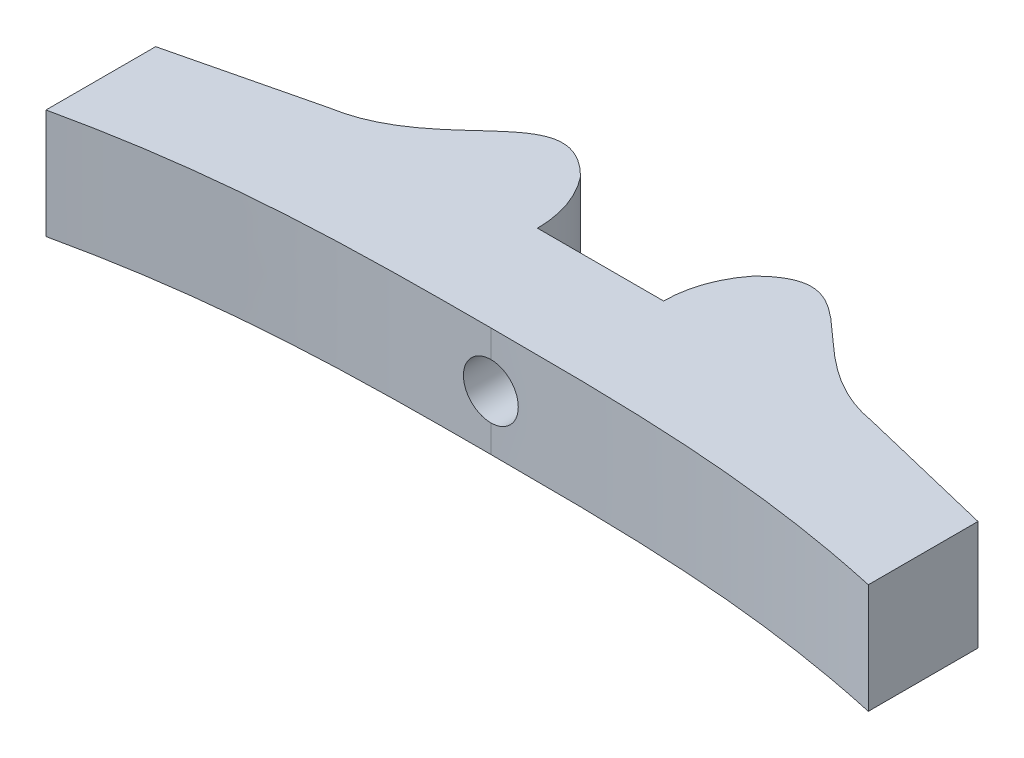
ISO-10303-21;
HEADER;
FILE_DESCRIPTION(('STEP AP214'),'2;1');
FILE_NAME('part.step','',(''),(''),'','','');
FILE_SCHEMA(('AUTOMOTIVE_DESIGN { 1 0 10303 214 1 1 1 1 }'));
ENDSEC;
DATA;
#1=APPLICATION_CONTEXT('core data for automotive mechanical design processes');
#2=APPLICATION_PROTOCOL_DEFINITION('international standard','automotive_design',2000,#1);
#3=PRODUCT_CONTEXT('',#1,'mechanical');
#4=PRODUCT('Part','Part','',(#3));
#5=PRODUCT_RELATED_PRODUCT_CATEGORY('part','',(#4));
#6=PRODUCT_DEFINITION_FORMATION('','',#4);
#7=PRODUCT_DEFINITION_CONTEXT('part definition',#1,'design');
#8=PRODUCT_DEFINITION('design','',#6,#7);
#9=PRODUCT_DEFINITION_SHAPE('','',#8);
#10=(LENGTH_UNIT() NAMED_UNIT(*) SI_UNIT(.MILLI.,.METRE.));
#11=(NAMED_UNIT(*) PLANE_ANGLE_UNIT() SI_UNIT($,.RADIAN.));
#12=(NAMED_UNIT(*) SI_UNIT($,.STERADIAN.) SOLID_ANGLE_UNIT());
#13=UNCERTAINTY_MEASURE_WITH_UNIT(LENGTH_MEASURE(1.E-05),#10,'distance_accuracy_value','');
#14=(GEOMETRIC_REPRESENTATION_CONTEXT(3) GLOBAL_UNCERTAINTY_ASSIGNED_CONTEXT((#13)) GLOBAL_UNIT_ASSIGNED_CONTEXT((#10,
#11,#12)) REPRESENTATION_CONTEXT('',''));
#15=CARTESIAN_POINT('',(0.,0.,0.));
#16=DIRECTION('',(0.,0.,1.));
#17=DIRECTION('',(1.,0.,0.));
#18=AXIS2_PLACEMENT_3D('',#15,#16,#17);
#19=CARTESIAN_POINT('',(-19.05,5.08,6.64176426052734));
#20=CARTESIAN_POINT('',(-12.2108875447227,5.08,5.13329478113357));
#21=CARTESIAN_POINT('',(-6.48799064651243,5.08,5.08));
#22=CARTESIAN_POINT('',(0.,5.08,5.08));
#23=B_SPLINE_CURVE_WITH_KNOTS('',3,(#19,#20,#21,#22),.UNSPECIFIED.,.F.,.F.,(4,4),(0.,1.),.UNSPECIFIED.);
#24=DIRECTION('',(0.,-1.,0.));
#25=VECTOR('',#24,1.);
#26=SURFACE_OF_LINEAR_EXTRUSION('',#23,#25);
#27=DIRECTION('',(0.,-1.,0.));
#28=VECTOR('',#27,1.);
#29=CARTESIAN_POINT('',(0.,5.08,5.08));
#30=LINE('',#29,#28);
#31=CARTESIAN_POINT('',(0.,1.27,5.08));
#32=VERTEX_POINT('',#31);
#33=CARTESIAN_POINT('',(0.,0.,5.08));
#34=VERTEX_POINT('',#33);
#35=EDGE_CURVE('E42',#32,#34,#30,.T.);
#36=ORIENTED_EDGE('',*,*,#35,.F.);
#37=CARTESIAN_POINT('',(0.,1.27,5.08));
#38=CARTESIAN_POINT('',(-0.0357302752545221,1.26999964347344,5.07999998931521));
#39=CARTESIAN_POINT('',(-0.0714447181891026,1.27150857866227,5.0800016190983));
#40=CARTESIAN_POINT('',(-0.142616127848637,1.27752758238914,5.0800085296371));
#41=CARTESIAN_POINT('',(-0.178073120382655,1.28203734577878,5.08001381002158));
#42=CARTESIAN_POINT('',(-0.283619615093024,1.30002332664184,5.0800356595675));
#43=CARTESIAN_POINT('',(-0.352998205928226,1.31795635699132,5.08005823478345));
#44=CARTESIAN_POINT('',(-0.487786709185454,1.36523728293279,5.08012014991618));
#45=CARTESIAN_POINT('',(-0.553194764009821,1.39459047453563,5.08015949761188));
#46=CARTESIAN_POINT('',(-0.646845533960496,1.44648803549575,5.08022920361549));
#47=CARTESIAN_POINT('',(-0.677321945513148,1.46510094520565,5.08025422296175));
#48=CARTESIAN_POINT('',(-0.736630203470928,1.50484234428994,5.08030724662216));
#49=CARTESIAN_POINT('',(-0.765460450785508,1.52597322013882,5.0803352537654));
#50=CARTESIAN_POINT('',(-0.849086338245586,1.59287867866189,5.0804226399528));
#51=CARTESIAN_POINT('',(-0.901097330928893,1.6422106433568,5.08048544607818));
#52=CARTESIAN_POINT('',(-0.996086346639456,1.74891573982974,5.08061257116622));
#53=CARTESIAN_POINT('',(-1.03906435229524,1.80628888707151,5.08067689013179));
#54=CARTESIAN_POINT('',(-1.09583957753939,1.89710355381789,5.08076795823964));
#55=CARTESIAN_POINT('',(-1.11349233890045,1.92819101328751,5.08079743127059));
#56=CARTESIAN_POINT('',(-1.1461029077439,1.99171014528473,5.08085351119176));
#57=CARTESIAN_POINT('',(-1.16106328214546,2.0241405008108,5.08088012080212));
#58=CARTESIAN_POINT('',(-1.20176414362685,2.12316996833055,5.08095418618069));
#59=CARTESIAN_POINT('',(-1.22334249342489,2.19153653617515,5.08099590914958));
#60=CARTESIAN_POINT('',(-1.25470307116908,2.3308881953047,5.08105764945907));
#61=CARTESIAN_POINT('',(-1.26448506906271,2.40187333762927,5.08107766637635));
#62=CARTESIAN_POINT('',(-1.27199693456687,2.54448892390212,5.08109297524417));
#63=CARTESIAN_POINT('',(-1.26972652509974,2.61611938264805,5.08108826662628));
#64=CARTESIAN_POINT('',(-1.25318943614433,2.75798102962741,5.0810548327822));
#65=CARTESIAN_POINT('',(-1.23892289551118,2.82821223404757,5.08102610783401));
#66=CARTESIAN_POINT('',(-1.19880861519168,2.96527573481352,5.08094902311697));
#67=CARTESIAN_POINT('',(-1.17296091213977,3.03210804191024,5.08090066341025));
#68=CARTESIAN_POINT('',(-1.11038592049241,3.16051374537465,5.08079143465688));
#69=CARTESIAN_POINT('',(-1.07365833705579,3.22208699916547,5.08073056527125));
#70=CARTESIAN_POINT('',(-1.01126847965837,3.30910003808684,5.08063641663764));
#71=CARTESIAN_POINT('',(-0.98925085652991,3.33721779378591,5.08060455371491));
#72=CARTESIAN_POINT('',(-0.942906686577498,3.39152937579231,5.08054089106863));
#73=CARTESIAN_POINT('',(-0.918577932038028,3.41772131922997,5.08050909143576));
#74=CARTESIAN_POINT('',(-0.842436490930791,3.49304122649367,5.08041543709395));
#75=CARTESIAN_POINT('',(-0.787412670661504,3.53899114397422,5.08035523824594));
#76=CARTESIAN_POINT('',(-0.670426920638462,3.62098571311283,5.08024628711297));
#77=CARTESIAN_POINT('',(-0.608465254843071,3.65703074143375,5.08019753439276));
#78=CARTESIAN_POINT('',(-0.511665744418292,3.70291858421552,5.08013608281088));
#79=CARTESIAN_POINT('',(-0.478720159588864,3.71686146906602,5.08011753201624));
#80=CARTESIAN_POINT('',(-0.41180473947098,3.74191245938181,5.08008453614289));
#81=CARTESIAN_POINT('',(-0.377835758873321,3.75302286082656,5.08007008773774));
#82=CARTESIAN_POINT('',(-0.274762339887037,3.78196547990777,5.08003306472308));
#83=CARTESIAN_POINT('',(-0.204359749568244,3.79547140808229,5.08001672882296));
#84=CARTESIAN_POINT('',(-0.111264070937656,3.80531502263597,5.08000524390741));
#85=CARTESIAN_POINT('',(-0.0890285966944468,3.80707273582486,5.08000324970009));
#86=CARTESIAN_POINT('',(-0.0445327083838663,3.80941329539492,5.08000063092685));
#87=CARTESIAN_POINT('',(-0.0222723963152364,3.80999807922764,5.08000000410212));
#88=CARTESIAN_POINT('',(0.,3.81,5.08));
#89=B_SPLINE_CURVE_WITH_KNOTS('',3,(#37,#38,#39,#40,#41,#42,#43,#44,#45,#46,#47,#48,#49,#50,#51,
#52,#53,#54,#55,#56,#57,#58,#59,#60,#61,#62,#63,#64,#65,#66,#67,#68,#69,#70,#71,#72,#73,#74,#75,
#76,#77,#78,#79,#80,#81,#82,#83,#84,#85,#86,#87,#88),.UNSPECIFIED.,.F.,.F.,(4,2,2,2,2,2,2,2,2,2,
2,2,2,2,2,2,2,2,2,2,2,2,2,2,2,4),(0.,0.107127555652252,0.214244219375734,0.428141208491133,
0.6421375091309,0.749158701558476,0.856282145456588,1.0702573218197,1.2842329096778,
1.39137069148187,1.49840578076109,1.7123745317022,1.92634745539562,2.14032529822041,
2.35430066428762,2.56827535349595,2.7822558418782,2.88928437121285,2.99641618815525,
3.21039583576486,3.42436734503558,3.53157613385682,3.63869774212231,3.85250915208833,
3.9194050798481,3.98619041722325),.UNSPECIFIED.);
#90=CARTESIAN_POINT('',(0.,3.81,5.08));
#91=VERTEX_POINT('',#90);
#92=EDGE_CURVE('E48',#32,#91,#89,.T.);
#93=ORIENTED_EDGE('',*,*,#92,.T.);
#94=CARTESIAN_POINT('',(0.,5.08,5.08));
#95=VERTEX_POINT('',#94);
#96=EDGE_CURVE('E11',#95,#91,#30,.T.);
#97=ORIENTED_EDGE('',*,*,#96,.F.);
#98=CARTESIAN_POINT('',(-19.05,5.08,6.64176426052734));
#99=VERTEX_POINT('',#98);
#100=EDGE_CURVE('E202',#99,#95,#23,.T.);
#101=ORIENTED_EDGE('',*,*,#100,.F.);
#102=DIRECTION('',(0.,-1.,0.));
#103=VECTOR('',#102,1.);
#104=CARTESIAN_POINT('',(-19.05,5.08,6.64176426052734));
#105=LINE('',#104,#103);
#106=CARTESIAN_POINT('',(-19.05,0.,6.64176426052734));
#107=VERTEX_POINT('',#106);
#108=EDGE_CURVE('E154',#99,#107,#105,.T.);
#109=ORIENTED_EDGE('',*,*,#108,.T.);
#110=CARTESIAN_POINT('',(-19.05,0.,6.64176426052734));
#111=CARTESIAN_POINT('',(-12.2108875447227,0.,5.13329478113357));
#112=CARTESIAN_POINT('',(-6.48799064651243,0.,5.08));
#113=CARTESIAN_POINT('',(0.,0.,5.08));
#114=B_SPLINE_CURVE_WITH_KNOTS('',3,(#110,#111,#112,#113),.UNSPECIFIED.,.F.,.F.,(4,4),(0.,1.),.UNSPECIFIED.);
#115=EDGE_CURVE('E161',#107,#34,#114,.T.);
#116=ORIENTED_EDGE('',*,*,#115,.T.);
#117=EDGE_LOOP('',(#36,#93,#97,#101,#109,#116));
#118=FACE_BOUND('',#117,.T.);
#119=ADVANCED_FACE('F33',(#118),#26,.F.);
#120=CARTESIAN_POINT('',(0.,5.08,5.08));
#121=CARTESIAN_POINT('',(6.48799064651243,5.08,5.08));
#122=CARTESIAN_POINT('',(12.2108875447227,5.08,5.13329478113357));
#123=CARTESIAN_POINT('',(19.05,5.08,6.64176426052734));
#124=B_SPLINE_CURVE_WITH_KNOTS('',3,(#120,#121,#122,#123),.UNSPECIFIED.,.F.,.F.,(4,4),(0.,1.),.UNSPECIFIED.);
#125=DIRECTION('',(0.,-1.,0.));
#126=VECTOR('',#125,1.);
#127=SURFACE_OF_LINEAR_EXTRUSION('',#124,#126);
#128=ORIENTED_EDGE('',*,*,#96,.T.);
#129=CARTESIAN_POINT('',(0.,3.81,5.08));
#130=CARTESIAN_POINT('',(0.035730275254522,3.81000035652656,5.07999998931521));
#131=CARTESIAN_POINT('',(0.0714447181891024,3.80849142133773,5.0800016190983));
#132=CARTESIAN_POINT('',(0.142616127848637,3.80247241761086,5.0800085296371));
#133=CARTESIAN_POINT('',(0.178073120382655,3.79796265422122,5.08001381002158));
#134=CARTESIAN_POINT('',(0.283619615093023,3.77997667335816,5.0800356595675));
#135=CARTESIAN_POINT('',(0.352998205928225,3.76204364300868,5.08005823478345));
#136=CARTESIAN_POINT('',(0.487786709185453,3.71476271706721,5.08012014991618));
#137=CARTESIAN_POINT('',(0.553194764009821,3.68540952546437,5.08015949761188));
#138=CARTESIAN_POINT('',(0.646845533960495,3.63351196450425,5.08022920361549));
#139=CARTESIAN_POINT('',(0.677321945513146,3.61489905479435,5.08025422296175));
#140=CARTESIAN_POINT('',(0.736630203470927,3.57515765571006,5.08030724662216));
#141=CARTESIAN_POINT('',(0.765460450785509,3.55402677986119,5.0803352537654));
#142=CARTESIAN_POINT('',(0.849086338245588,3.48712132133811,5.0804226399528));
#143=CARTESIAN_POINT('',(0.901097330928893,3.4377893566432,5.08048544607818));
#144=CARTESIAN_POINT('',(0.996086346639455,3.33108426017026,5.08061257116622));
#145=CARTESIAN_POINT('',(1.03906435229524,3.27371111292848,5.08067689013179));
#146=CARTESIAN_POINT('',(1.09583957753939,3.18289644618211,5.08076795823964));
#147=CARTESIAN_POINT('',(1.11349233890045,3.15180898671249,5.08079743127059));
#148=CARTESIAN_POINT('',(1.1461029077439,3.08828985471526,5.08085351119176));
#149=CARTESIAN_POINT('',(1.16106328214547,3.0558594991892,5.08088012080212));
#150=CARTESIAN_POINT('',(1.20176414362685,2.95683003166945,5.08095418618069));
#151=CARTESIAN_POINT('',(1.22334249342489,2.88846346382484,5.08099590914958));
#152=CARTESIAN_POINT('',(1.25470307116908,2.7491118046953,5.08105764945907));
#153=CARTESIAN_POINT('',(1.26448506906271,2.67812666237073,5.08107766637635));
#154=CARTESIAN_POINT('',(1.27199693456687,2.53551107609788,5.08109297524417));
#155=CARTESIAN_POINT('',(1.26972652509974,2.46388061735195,5.08108826662628));
#156=CARTESIAN_POINT('',(1.25318943614433,2.32201897037259,5.0810548327822));
#157=CARTESIAN_POINT('',(1.23892289551118,2.25178776595243,5.08102610783401));
#158=CARTESIAN_POINT('',(1.19880861519168,2.11472426518648,5.08094902311697));
#159=CARTESIAN_POINT('',(1.17296091213977,2.04789195808976,5.08090066341025));
#160=CARTESIAN_POINT('',(1.1103859204924,1.91948625462535,5.08079143465688));
#161=CARTESIAN_POINT('',(1.07365833705579,1.85791300083453,5.08073056527125));
#162=CARTESIAN_POINT('',(1.01126847965837,1.77089996191316,5.08063641663764));
#163=CARTESIAN_POINT('',(0.989250856529909,1.74278220621409,5.08060455371491));
#164=CARTESIAN_POINT('',(0.942906686577497,1.68847062420769,5.08054089106864));
#165=CARTESIAN_POINT('',(0.918577932038027,1.66227868077003,5.08050909143576));
#166=CARTESIAN_POINT('',(0.84243649093079,1.58695877350633,5.08041543709395));
#167=CARTESIAN_POINT('',(0.787412670661504,1.54100885602578,5.08035523824594));
#168=CARTESIAN_POINT('',(0.670426920638461,1.45901428688717,5.08024628711297));
#169=CARTESIAN_POINT('',(0.608465254843069,1.42296925856625,5.08019753439276));
#170=CARTESIAN_POINT('',(0.511665744418291,1.37708141578448,5.08013608281088));
#171=CARTESIAN_POINT('',(0.478720159588863,1.36313853093398,5.08011753201624));
#172=CARTESIAN_POINT('',(0.411804739470979,1.33808754061819,5.08008453614289));
#173=CARTESIAN_POINT('',(0.37783575887332,1.32697713917344,5.08007008773773));
#174=CARTESIAN_POINT('',(0.274762339887036,1.29803452009224,5.08003306472308));
#175=CARTESIAN_POINT('',(0.204359749568244,1.28452859191771,5.08001672882296));
#176=CARTESIAN_POINT('',(0.111264070937656,1.27468497736403,5.0800052439074));
#177=CARTESIAN_POINT('',(0.0890285966944464,1.27292726417514,5.08000324970009));
#178=CARTESIAN_POINT('',(0.0445327083838661,1.27058670460508,5.08000063092686));
#179=CARTESIAN_POINT('',(0.0222723963152363,1.27000192077236,5.08000000410212));
#180=CARTESIAN_POINT('',(0.,1.27,5.08));
#181=B_SPLINE_CURVE_WITH_KNOTS('',3,(#129,#130,#131,#132,#133,#134,#135,#136,#137,#138,#139,
#140,#141,#142,#143,#144,#145,#146,#147,#148,#149,#150,#151,#152,#153,#154,#155,#156,#157,#158,
#159,#160,#161,#162,#163,#164,#165,#166,#167,#168,#169,#170,#171,#172,#173,#174,#175,#176,#177,
#178,#179,#180),.UNSPECIFIED.,.F.,.F.,(4,2,2,2,2,2,2,2,2,2,2,2,2,2,2,2,2,2,2,2,2,2,2,2,2,4),(0.,
0.107127555652251,0.214244219375733,0.428141208491133,0.642137509130899,0.749158701558475,
0.856282145456586,1.0702573218197,1.2842329096778,1.39137069148187,1.4984057807611,
1.7123745317022,1.92634745539562,2.14032529822041,2.35430066428762,2.56827535349596,
2.7822558418782,2.88928437121285,2.99641618815525,3.21039583576486,3.42436734503558,
3.53157613385682,3.63869774212231,3.85250915208833,3.9194050798481,3.98619041722325),.UNSPECIFIED.);
#182=EDGE_CURVE('E228',#91,#32,#181,.T.);
#183=ORIENTED_EDGE('',*,*,#182,.T.);
#184=ORIENTED_EDGE('',*,*,#35,.T.);
#185=CARTESIAN_POINT('',(0.,0.,5.08));
#186=CARTESIAN_POINT('',(6.48799064651243,0.,5.08));
#187=CARTESIAN_POINT('',(12.2108875447227,0.,5.13329478113357));
#188=CARTESIAN_POINT('',(19.05,0.,6.64176426052734));
#189=B_SPLINE_CURVE_WITH_KNOTS('',3,(#185,#186,#187,#188),.UNSPECIFIED.,.F.,.F.,(4,4),(0.,1.),.UNSPECIFIED.);
#190=CARTESIAN_POINT('',(19.05,0.,6.64176426052734));
#191=VERTEX_POINT('',#190);
#192=EDGE_CURVE('E166',#34,#191,#189,.T.);
#193=ORIENTED_EDGE('',*,*,#192,.T.);
#194=DIRECTION('',(0.,-1.,0.));
#195=VECTOR('',#194,1.);
#196=CARTESIAN_POINT('',(19.05,5.08,6.64176426052734));
#197=LINE('',#196,#195);
#198=CARTESIAN_POINT('',(19.05,5.08,6.64176426052734));
#199=VERTEX_POINT('',#198);
#200=EDGE_CURVE('E220',#199,#191,#197,.T.);
#201=ORIENTED_EDGE('',*,*,#200,.F.);
#202=EDGE_CURVE('E107',#95,#199,#124,.T.);
#203=ORIENTED_EDGE('',*,*,#202,.F.);
#204=EDGE_LOOP('',(#128,#183,#184,#193,#201,#203));
#205=FACE_BOUND('',#204,.T.);
#206=ADVANCED_FACE('F227',(#205),#127,.F.);
#207=CARTESIAN_POINT('',(19.05,5.08,6.64176426052734));
#208=DIRECTION('',(-1.,0.,0.));
#209=DIRECTION('',(0.,0.,1.));
#210=AXIS2_PLACEMENT_3D('',#207,#208,#209);
#211=PLANE('',#210);
#212=DIRECTION('',(0.,0.,-1.));
#213=VECTOR('',#212,1.);
#214=CARTESIAN_POINT('',(19.05,0.,6.64176426052734));
#215=LINE('',#214,#213);
#216=CARTESIAN_POINT('',(19.05,0.,1.56176426052734));
#217=VERTEX_POINT('',#216);
#218=EDGE_CURVE('E173',#191,#217,#215,.T.);
#219=ORIENTED_EDGE('',*,*,#218,.T.);
#220=DIRECTION('',(0.,-1.,0.));
#221=VECTOR('',#220,1.);
#222=CARTESIAN_POINT('',(19.05,5.08,1.56176426052734));
#223=LINE('',#222,#221);
#224=CARTESIAN_POINT('',(19.05,5.08,1.56176426052734));
#225=VERTEX_POINT('',#224);
#226=EDGE_CURVE('E218',#225,#217,#223,.T.);
#227=ORIENTED_EDGE('',*,*,#226,.F.);
#228=DIRECTION('',(0.,0.,-1.));
#229=VECTOR('',#228,1.);
#230=CARTESIAN_POINT('',(19.05,5.08,6.64176426052734));
#231=LINE('',#230,#229);
#232=EDGE_CURVE('E265',#199,#225,#231,.T.);
#233=ORIENTED_EDGE('',*,*,#232,.F.);
#234=ORIENTED_EDGE('',*,*,#200,.T.);
#235=EDGE_LOOP('',(#219,#227,#233,#234));
#236=FACE_BOUND('',#235,.T.);
#237=ADVANCED_FACE('F264',(#236),#211,.F.);
#238=CARTESIAN_POINT('',(19.05,5.08,1.56176426052734));
#239=DIRECTION('',(-0.235059889612951,0.,0.971980888852835));
#240=DIRECTION('',(0.971980888852835,0.,0.235059889612951));
#241=AXIS2_PLACEMENT_3D('',#238,#239,#240);
#242=PLANE('',#241);
#243=DIRECTION('',(-0.971980888852835,0.,-0.235059889612951));
#244=VECTOR('',#243,1.);
#245=CARTESIAN_POINT('',(19.05,0.,1.56176426052734));
#246=LINE('',#245,#244);
#247=CARTESIAN_POINT('',(12.59205,0.,0.));
#248=VERTEX_POINT('',#247);
#249=EDGE_CURVE('E178',#217,#248,#246,.T.);
#250=ORIENTED_EDGE('',*,*,#249,.T.);
#251=DIRECTION('',(0.,-1.,0.));
#252=VECTOR('',#251,1.);
#253=CARTESIAN_POINT('',(12.59205,5.08,0.));
#254=LINE('',#253,#252);
#255=CARTESIAN_POINT('',(12.59205,5.08,0.));
#256=VERTEX_POINT('',#255);
#257=EDGE_CURVE('E215',#256,#248,#254,.T.);
#258=ORIENTED_EDGE('',*,*,#257,.F.);
#259=DIRECTION('',(-0.971980888852835,0.,-0.235059889612951));
#260=VECTOR('',#259,1.);
#261=CARTESIAN_POINT('',(19.05,5.08,1.56176426052734));
#262=LINE('',#261,#260);
#263=EDGE_CURVE('E262',#225,#256,#262,.T.);
#264=ORIENTED_EDGE('',*,*,#263,.F.);
#265=ORIENTED_EDGE('',*,*,#226,.T.);
#266=EDGE_LOOP('',(#250,#258,#264,#265));
#267=FACE_BOUND('',#266,.T.);
#268=ADVANCED_FACE('F261',(#267),#242,.F.);
#269=CARTESIAN_POINT('',(12.59205,5.08,0.));
#270=CARTESIAN_POINT('',(8.04910409744128,5.08,-0.757810135921079));
#271=CARTESIAN_POINT('',(7.05105842274532,5.08,-6.1392470212712));
#272=CARTESIAN_POINT('',(3.98565793579861,5.08,-3.05923525878993));
#273=B_SPLINE_CURVE_WITH_KNOTS('',3,(#269,#270,#271,#272),.UNSPECIFIED.,.F.,.F.,(4,4),(0.,1.),.UNSPECIFIED.);
#274=DIRECTION('',(0.,-1.,0.));
#275=VECTOR('',#274,1.);
#276=SURFACE_OF_LINEAR_EXTRUSION('',#273,#275);
#277=CARTESIAN_POINT('',(12.59205,0.,0.));
#278=CARTESIAN_POINT('',(8.04910409744128,0.,-0.757810135921079));
#279=CARTESIAN_POINT('',(7.05105842274532,0.,-6.1392470212712));
#280=CARTESIAN_POINT('',(3.98565793579861,0.,-3.05923525878993));
#281=B_SPLINE_CURVE_WITH_KNOTS('',3,(#277,#278,#279,#280),.UNSPECIFIED.,.F.,.F.,(4,4),(0.,1.),.UNSPECIFIED.);
#282=CARTESIAN_POINT('',(3.98565793579861,0.,-3.05923525878993));
#283=VERTEX_POINT('',#282);
#284=EDGE_CURVE('E180',#248,#283,#281,.T.);
#285=ORIENTED_EDGE('',*,*,#284,.T.);
#286=DIRECTION('',(0.,-1.,0.));
#287=VECTOR('',#286,1.);
#288=CARTESIAN_POINT('',(3.98565793579861,5.08,-3.05923525878993));
#289=LINE('',#288,#287);
#290=CARTESIAN_POINT('',(3.98565793579861,5.08,-3.05923525878993));
#291=VERTEX_POINT('',#290);
#292=EDGE_CURVE('E212',#291,#283,#289,.T.);
#293=ORIENTED_EDGE('',*,*,#292,.F.);
#294=EDGE_CURVE('E258',#256,#291,#273,.T.);
#295=ORIENTED_EDGE('',*,*,#294,.F.);
#296=ORIENTED_EDGE('',*,*,#257,.T.);
#297=EDGE_LOOP('',(#285,#293,#295,#296));
#298=FACE_BOUND('',#297,.T.);
#299=ADVANCED_FACE('F255',(#298),#276,.F.);
#300=CARTESIAN_POINT('',(7.8486,5.08,0.));
#301=DIRECTION('',(0.,-1.,0.));
#302=DIRECTION('',(0.,0.,-1.));
#303=AXIS2_PLACEMENT_3D('',#300,#301,#302);
#304=CYLINDRICAL_SURFACE('',#303,4.9276);
#305=CARTESIAN_POINT('',(7.8486,0.,0.));
#306=DIRECTION('',(0.,1.,0.));
#307=DIRECTION('',(0.,0.,1.));
#308=AXIS2_PLACEMENT_3D('',#305,#306,#307);
#309=CIRCLE('',#308,4.9276);
#310=CARTESIAN_POINT('',(2.921,0.,0.));
#311=VERTEX_POINT('',#310);
#312=EDGE_CURVE('E184',#283,#311,#309,.T.);
#313=ORIENTED_EDGE('',*,*,#312,.T.);
#314=DIRECTION('',(0.,-1.,0.));
#315=VECTOR('',#314,1.);
#316=CARTESIAN_POINT('',(2.921,5.08,0.));
#317=LINE('',#316,#315);
#318=CARTESIAN_POINT('',(2.921,5.08,0.));
#319=VERTEX_POINT('',#318);
#320=EDGE_CURVE('E209',#319,#311,#317,.T.);
#321=ORIENTED_EDGE('',*,*,#320,.F.);
#322=CARTESIAN_POINT('',(7.8486,5.08,0.));
#323=DIRECTION('',(0.,1.,0.));
#324=DIRECTION('',(0.,0.,1.));
#325=AXIS2_PLACEMENT_3D('',#322,#323,#324);
#326=CIRCLE('',#325,4.9276);
#327=EDGE_CURVE('E251',#291,#319,#326,.T.);
#328=ORIENTED_EDGE('',*,*,#327,.F.);
#329=ORIENTED_EDGE('',*,*,#292,.T.);
#330=EDGE_LOOP('',(#313,#321,#328,#329));
#331=FACE_BOUND('',#330,.T.);
#332=ADVANCED_FACE('F250',(#331),#304,.T.);
#333=CARTESIAN_POINT('',(-2.921,5.08,0.));
#334=DIRECTION('',(0.,0.,1.));
#335=DIRECTION('',(1.,0.,0.));
#336=AXIS2_PLACEMENT_3D('',#333,#334,#335);
#337=PLANE('',#336);
#338=CARTESIAN_POINT('',(0.,2.54,0.));
#339=DIRECTION('',(0.,0.,-1.));
#340=DIRECTION('',(-1.,0.,0.));
#341=AXIS2_PLACEMENT_3D('',#338,#339,#340);
#342=CIRCLE('',#341,1.27);
#343=CARTESIAN_POINT('',(-1.27,2.54,0.));
#344=VERTEX_POINT('',#343);
#345=EDGE_CURVE('E298',#344,#344,#342,.T.);
#346=ORIENTED_EDGE('',*,*,#345,.F.);
#347=EDGE_LOOP('',(#346));
#348=FACE_BOUND('',#347,.T.);
#349=DIRECTION('',(-1.,0.,0.));
#350=VECTOR('',#349,1.);
#351=CARTESIAN_POINT('',(-2.921,0.,0.));
#352=LINE('',#351,#350);
#353=CARTESIAN_POINT('',(-2.921,0.,0.));
#354=VERTEX_POINT('',#353);
#355=EDGE_CURVE('E189',#311,#354,#352,.T.);
#356=ORIENTED_EDGE('',*,*,#355,.T.);
#357=DIRECTION('',(0.,-1.,0.));
#358=VECTOR('',#357,1.);
#359=CARTESIAN_POINT('',(-2.921,5.08,0.));
#360=LINE('',#359,#358);
#361=CARTESIAN_POINT('',(-2.921,5.08,0.));
#362=VERTEX_POINT('',#361);
#363=EDGE_CURVE('E206',#362,#354,#360,.T.);
#364=ORIENTED_EDGE('',*,*,#363,.F.);
#365=DIRECTION('',(-1.,0.,0.));
#366=VECTOR('',#365,1.);
#367=CARTESIAN_POINT('',(-2.921,5.08,0.));
#368=LINE('',#367,#366);
#369=EDGE_CURVE('E246',#319,#362,#368,.T.);
#370=ORIENTED_EDGE('',*,*,#369,.F.);
#371=ORIENTED_EDGE('',*,*,#320,.T.);
#372=EDGE_LOOP('',(#356,#364,#370,#371));
#373=FACE_BOUND('',#372,.T.);
#374=ADVANCED_FACE('F245',(#348,#373),#337,.F.);
#375=CARTESIAN_POINT('',(-7.8486,5.08,0.));
#376=DIRECTION('',(0.,-1.,0.));
#377=DIRECTION('',(0.,0.,-1.));
#378=AXIS2_PLACEMENT_3D('',#375,#376,#377);
#379=CYLINDRICAL_SURFACE('',#378,4.9276);
#380=CARTESIAN_POINT('',(-7.8486,0.,0.));
#381=DIRECTION('',(0.,1.,0.));
#382=DIRECTION('',(0.,0.,-1.));
#383=AXIS2_PLACEMENT_3D('',#380,#381,#382);
#384=CIRCLE('',#383,4.9276);
#385=CARTESIAN_POINT('',(-3.98565793579861,0.,-3.05923525878993));
#386=VERTEX_POINT('',#385);
#387=EDGE_CURVE('E191',#354,#386,#384,.T.);
#388=ORIENTED_EDGE('',*,*,#387,.T.);
#389=DIRECTION('',(0.,-1.,0.));
#390=VECTOR('',#389,1.);
#391=CARTESIAN_POINT('',(-3.98565793579861,5.08,-3.05923525878993));
#392=LINE('',#391,#390);
#393=CARTESIAN_POINT('',(-3.98565793579861,5.08,-3.05923525878993));
#394=VERTEX_POINT('',#393);
#395=EDGE_CURVE('E149',#394,#386,#392,.T.);
#396=ORIENTED_EDGE('',*,*,#395,.F.);
#397=CARTESIAN_POINT('',(-7.8486,5.08,0.));
#398=DIRECTION('',(0.,1.,0.));
#399=DIRECTION('',(0.,0.,-1.));
#400=AXIS2_PLACEMENT_3D('',#397,#398,#399);
#401=CIRCLE('',#400,4.9276);
#402=EDGE_CURVE('E137',#362,#394,#401,.T.);
#403=ORIENTED_EDGE('',*,*,#402,.F.);
#404=ORIENTED_EDGE('',*,*,#363,.T.);
#405=EDGE_LOOP('',(#388,#396,#403,#404));
#406=FACE_BOUND('',#405,.T.);
#407=ADVANCED_FACE('F241',(#406),#379,.T.);
#408=CARTESIAN_POINT('',(-3.98565793579861,5.08,-3.05923525878993));
#409=CARTESIAN_POINT('',(-7.05105842274532,5.08,-6.1392470212712));
#410=CARTESIAN_POINT('',(-8.04910409744128,5.08,-0.757810135921079));
#411=CARTESIAN_POINT('',(-12.59205,5.08,0.));
#412=B_SPLINE_CURVE_WITH_KNOTS('',3,(#408,#409,#410,#411),.UNSPECIFIED.,.F.,.F.,(4,4),(0.,1.),.UNSPECIFIED.);
#413=DIRECTION('',(0.,-1.,0.));
#414=VECTOR('',#413,1.);
#415=SURFACE_OF_LINEAR_EXTRUSION('',#412,#414);
#416=CARTESIAN_POINT('',(-3.98565793579861,0.,-3.05923525878993));
#417=CARTESIAN_POINT('',(-7.05105842274532,0.,-6.1392470212712));
#418=CARTESIAN_POINT('',(-8.04910409744128,0.,-0.757810135921079));
#419=CARTESIAN_POINT('',(-12.59205,0.,0.));
#420=B_SPLINE_CURVE_WITH_KNOTS('',3,(#416,#417,#418,#419),.UNSPECIFIED.,.F.,.F.,(4,4),(0.,1.),.UNSPECIFIED.);
#421=CARTESIAN_POINT('',(-12.59205,0.,0.));
#422=VERTEX_POINT('',#421);
#423=EDGE_CURVE('E146',#386,#422,#420,.T.);
#424=ORIENTED_EDGE('',*,*,#423,.T.);
#425=DIRECTION('',(0.,-1.,0.));
#426=VECTOR('',#425,1.);
#427=CARTESIAN_POINT('',(-12.59205,5.08,0.));
#428=LINE('',#427,#426);
#429=CARTESIAN_POINT('',(-12.59205,5.08,0.));
#430=VERTEX_POINT('',#429);
#431=EDGE_CURVE('E143',#430,#422,#428,.T.);
#432=ORIENTED_EDGE('',*,*,#431,.F.);
#433=EDGE_CURVE('E130',#394,#430,#412,.T.);
#434=ORIENTED_EDGE('',*,*,#433,.F.);
#435=ORIENTED_EDGE('',*,*,#395,.T.);
#436=EDGE_LOOP('',(#424,#432,#434,#435));
#437=FACE_BOUND('',#436,.T.);
#438=ADVANCED_FACE('F144',(#437),#415,.F.);
#439=CARTESIAN_POINT('',(-19.05,5.08,1.56176426052734));
#440=DIRECTION('',(0.235059889612951,0.,0.971980888852835));
#441=DIRECTION('',(0.971980888852835,0.,-0.235059889612951));
#442=AXIS2_PLACEMENT_3D('',#439,#440,#441);
#443=PLANE('',#442);
#444=DIRECTION('',(-0.971980888852835,0.,0.235059889612951));
#445=VECTOR('',#444,1.);
#446=CARTESIAN_POINT('',(-19.05,0.,1.56176426052734));
#447=LINE('',#446,#445);
#448=CARTESIAN_POINT('',(-19.05,0.,1.56176426052734));
#449=VERTEX_POINT('',#448);
#450=EDGE_CURVE('E196',#422,#449,#447,.T.);
#451=ORIENTED_EDGE('',*,*,#450,.T.);
#452=DIRECTION('',(0.,-1.,0.));
#453=VECTOR('',#452,1.);
#454=CARTESIAN_POINT('',(-19.05,5.08,1.56176426052734));
#455=LINE('',#454,#453);
#456=CARTESIAN_POINT('',(-19.05,5.08,1.56176426052734));
#457=VERTEX_POINT('',#456);
#458=EDGE_CURVE('E150',#457,#449,#455,.T.);
#459=ORIENTED_EDGE('',*,*,#458,.F.);
#460=DIRECTION('',(-0.971980888852835,0.,0.235059889612951));
#461=VECTOR('',#460,1.);
#462=CARTESIAN_POINT('',(-19.05,5.08,1.56176426052734));
#463=LINE('',#462,#461);
#464=EDGE_CURVE('E134',#430,#457,#463,.T.);
#465=ORIENTED_EDGE('',*,*,#464,.F.);
#466=ORIENTED_EDGE('',*,*,#431,.T.);
#467=EDGE_LOOP('',(#451,#459,#465,#466));
#468=FACE_BOUND('',#467,.T.);
#469=ADVANCED_FACE('F152',(#468),#443,.F.);
#470=CARTESIAN_POINT('',(-19.05,5.08,6.64176426052734));
#471=DIRECTION('',(1.,0.,0.));
#472=DIRECTION('',(0.,0.,-1.));
#473=AXIS2_PLACEMENT_3D('',#470,#471,#472);
#474=PLANE('',#473);
#475=DIRECTION('',(0.,0.,1.));
#476=VECTOR('',#475,1.);
#477=CARTESIAN_POINT('',(-19.05,0.,6.64176426052734));
#478=LINE('',#477,#476);
#479=EDGE_CURVE('E99',#449,#107,#478,.T.);
#480=ORIENTED_EDGE('',*,*,#479,.T.);
#481=ORIENTED_EDGE('',*,*,#108,.F.);
#482=DIRECTION('',(0.,0.,1.));
#483=VECTOR('',#482,1.);
#484=CARTESIAN_POINT('',(-19.05,5.08,6.64176426052734));
#485=LINE('',#484,#483);
#486=EDGE_CURVE('E57',#457,#99,#485,.T.);
#487=ORIENTED_EDGE('',*,*,#486,.F.);
#488=ORIENTED_EDGE('',*,*,#458,.T.);
#489=EDGE_LOOP('',(#480,#481,#487,#488));
#490=FACE_BOUND('',#489,.T.);
#491=ADVANCED_FACE('F236',(#490),#474,.F.);
#492=CARTESIAN_POINT('',(-9.39332932171316,5.08,5.295206075491));
#493=DIRECTION('',(0.,-1.,0.));
#494=DIRECTION('',(0.,0.,-1.));
#495=AXIS2_PLACEMENT_3D('',#492,#493,#494);
#496=PLANE('',#495);
#497=ORIENTED_EDGE('',*,*,#100,.T.);
#498=ORIENTED_EDGE('',*,*,#202,.T.);
#499=ORIENTED_EDGE('',*,*,#232,.T.);
#500=ORIENTED_EDGE('',*,*,#263,.T.);
#501=ORIENTED_EDGE('',*,*,#294,.T.);
#502=ORIENTED_EDGE('',*,*,#327,.T.);
#503=ORIENTED_EDGE('',*,*,#369,.T.);
#504=ORIENTED_EDGE('',*,*,#402,.T.);
#505=ORIENTED_EDGE('',*,*,#433,.T.);
#506=ORIENTED_EDGE('',*,*,#464,.T.);
#507=ORIENTED_EDGE('',*,*,#486,.T.);
#508=EDGE_LOOP('',(#497,#498,#499,#500,#501,#502,#503,#504,#505,#506,#507));
#509=FACE_BOUND('',#508,.T.);
#510=ADVANCED_FACE('F132',(#509),#496,.F.);
#511=CARTESIAN_POINT('',(-9.39332932171316,0.,5.295206075491));
#512=DIRECTION('',(0.,-1.,0.));
#513=DIRECTION('',(0.,0.,-1.));
#514=AXIS2_PLACEMENT_3D('',#511,#512,#513);
#515=PLANE('',#514);
#516=ORIENTED_EDGE('',*,*,#115,.F.);
#517=ORIENTED_EDGE('',*,*,#479,.F.);
#518=ORIENTED_EDGE('',*,*,#450,.F.);
#519=ORIENTED_EDGE('',*,*,#423,.F.);
#520=ORIENTED_EDGE('',*,*,#387,.F.);
#521=ORIENTED_EDGE('',*,*,#355,.F.);
#522=ORIENTED_EDGE('',*,*,#312,.F.);
#523=ORIENTED_EDGE('',*,*,#284,.F.);
#524=ORIENTED_EDGE('',*,*,#249,.F.);
#525=ORIENTED_EDGE('',*,*,#218,.F.);
#526=ORIENTED_EDGE('',*,*,#192,.F.);
#527=EDGE_LOOP('',(#516,#517,#518,#519,#520,#521,#522,#523,#524,#525,#526));
#528=FACE_BOUND('',#527,.T.);
#529=ADVANCED_FACE('F232',(#528),#515,.T.);
#530=CARTESIAN_POINT('',(0.,2.54,6.64176426052734));
#531=DIRECTION('',(0.,0.,-1.));
#532=DIRECTION('',(-1.,0.,0.));
#533=AXIS2_PLACEMENT_3D('',#530,#531,#532);
#534=CYLINDRICAL_SURFACE('',#533,1.27);
#535=ORIENTED_EDGE('',*,*,#345,.T.);
#536=EDGE_LOOP('',(#535));
#537=FACE_BOUND('',#536,.T.);
#538=ORIENTED_EDGE('',*,*,#182,.F.);
#539=ORIENTED_EDGE('',*,*,#92,.F.);
#540=EDGE_LOOP('',(#538,#539));
#541=FACE_BOUND('',#540,.T.);
#542=ADVANCED_FACE('F302',(#537,#541),#534,.F.);
#543=CLOSED_SHELL('',(#119,#206,#237,#268,#299,#332,#374,#407,#438,#469,#491,#510,#529,#542));
#544=MANIFOLD_SOLID_BREP('B2',#543);
#545=ADVANCED_BREP_SHAPE_REPRESENTATION('',(#18,#544),#14);
#546=SHAPE_DEFINITION_REPRESENTATION(#9,#545);
ENDSEC;
END-ISO-10303-21;
